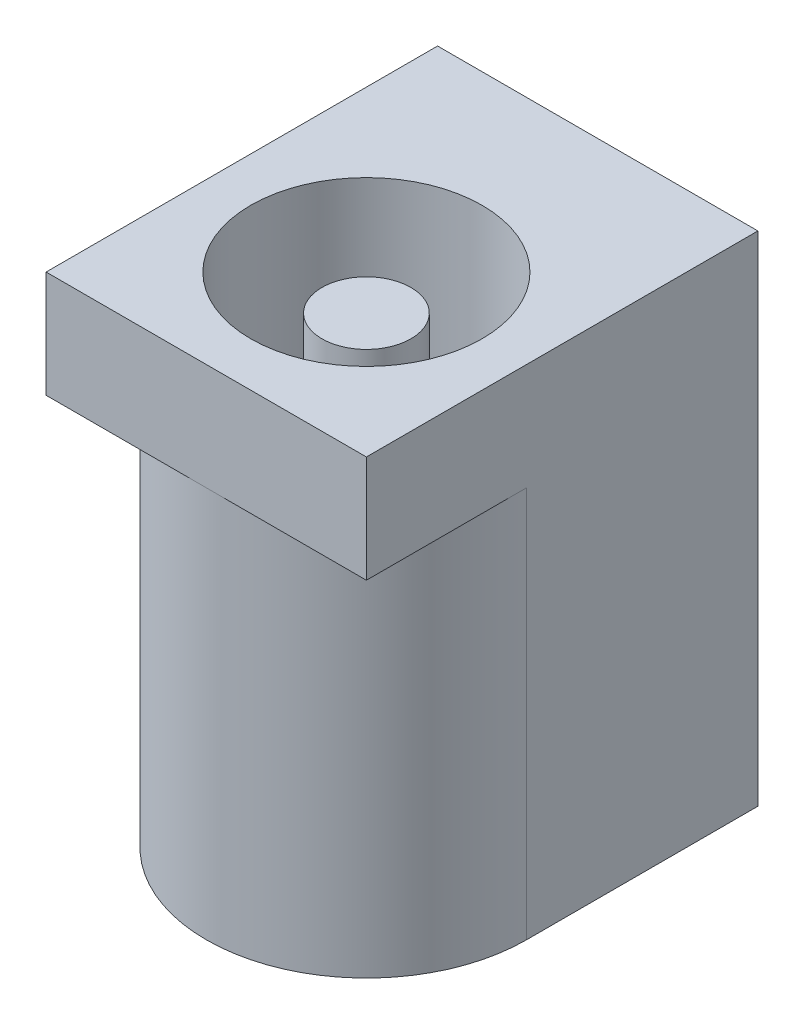
ISO-10303-21;
HEADER;
FILE_DESCRIPTION(('STEP AP214'),'2;1');
FILE_NAME('part.step','',(''),(''),'','','');
FILE_SCHEMA(('AUTOMOTIVE_DESIGN { 1 0 10303 214 1 1 1 1 }'));
ENDSEC;
DATA;
#1=APPLICATION_CONTEXT('core data for automotive mechanical design processes');
#2=APPLICATION_PROTOCOL_DEFINITION('international standard','automotive_design',2000,#1);
#3=PRODUCT_CONTEXT('',#1,'mechanical');
#4=PRODUCT('Part','Part','',(#3));
#5=PRODUCT_RELATED_PRODUCT_CATEGORY('part','',(#4));
#6=PRODUCT_DEFINITION_FORMATION('','',#4);
#7=PRODUCT_DEFINITION_CONTEXT('part definition',#1,'design');
#8=PRODUCT_DEFINITION('design','',#6,#7);
#9=PRODUCT_DEFINITION_SHAPE('','',#8);
#10=(LENGTH_UNIT() NAMED_UNIT(*) SI_UNIT(.MILLI.,.METRE.));
#11=(NAMED_UNIT(*) PLANE_ANGLE_UNIT() SI_UNIT($,.RADIAN.));
#12=(NAMED_UNIT(*) SI_UNIT($,.STERADIAN.) SOLID_ANGLE_UNIT());
#13=UNCERTAINTY_MEASURE_WITH_UNIT(LENGTH_MEASURE(1.E-05),#10,'distance_accuracy_value','');
#14=(GEOMETRIC_REPRESENTATION_CONTEXT(3) GLOBAL_UNCERTAINTY_ASSIGNED_CONTEXT((#13)) GLOBAL_UNIT_ASSIGNED_CONTEXT((#10,
#11,#12)) REPRESENTATION_CONTEXT('',''));
#15=CARTESIAN_POINT('',(0.,0.,0.));
#16=DIRECTION('',(0.,0.,1.));
#17=DIRECTION('',(1.,0.,0.));
#18=AXIS2_PLACEMENT_3D('',#15,#16,#17);
#19=CARTESIAN_POINT('',(-4.5,0.,11.));
#20=DIRECTION('',(0.,1.,0.));
#21=DIRECTION('',(0.,0.,1.));
#22=AXIS2_PLACEMENT_3D('',#19,#20,#21);
#23=PLANE('',#22);
#24=CARTESIAN_POINT('',(0.,0.,6.5));
#25=DIRECTION('',(0.,-1.,0.));
#26=DIRECTION('',(0.,0.,1.));
#27=AXIS2_PLACEMENT_3D('',#24,#25,#26);
#28=CIRCLE('',#27,4.5);
#29=CARTESIAN_POINT('',(4.5,0.,6.5));
#30=VERTEX_POINT('',#29);
#31=CARTESIAN_POINT('',(0.,0.,11.));
#32=VERTEX_POINT('',#31);
#33=EDGE_CURVE('E50',#30,#32,#28,.T.);
#34=ORIENTED_EDGE('',*,*,#33,.F.);
#35=DIRECTION('',(0.,0.,-1.));
#36=VECTOR('',#35,1.);
#37=CARTESIAN_POINT('',(4.5,0.,11.));
#38=LINE('',#37,#36);
#39=CARTESIAN_POINT('',(4.5,0.,11.));
#40=VERTEX_POINT('',#39);
#41=EDGE_CURVE('E167',#40,#30,#38,.T.);
#42=ORIENTED_EDGE('',*,*,#41,.F.);
#43=DIRECTION('',(1.,0.,0.));
#44=VECTOR('',#43,1.);
#45=CARTESIAN_POINT('',(-4.5,0.,11.));
#46=LINE('',#45,#44);
#47=EDGE_CURVE('E147',#32,#40,#46,.T.);
#48=ORIENTED_EDGE('',*,*,#47,.F.);
#49=EDGE_LOOP('',(#34,#42,#48));
#50=FACE_BOUND('',#49,.T.);
#51=ADVANCED_FACE('F39',(#50),#23,.F.);
#52=CARTESIAN_POINT('',(-4.5,3.,11.));
#53=DIRECTION('',(1.,0.,0.));
#54=DIRECTION('',(0.,0.,-1.));
#55=AXIS2_PLACEMENT_3D('',#52,#53,#54);
#56=PLANE('',#55);
#57=DIRECTION('',(0.,-1.,0.));
#58=VECTOR('',#57,1.);
#59=CARTESIAN_POINT('',(-4.5,3.,0.));
#60=LINE('',#59,#58);
#61=CARTESIAN_POINT('',(-4.5,3.,0.));
#62=VERTEX_POINT('',#61);
#63=CARTESIAN_POINT('',(-4.5,-11.,0.));
#64=VERTEX_POINT('',#63);
#65=EDGE_CURVE('E97',#62,#64,#60,.T.);
#66=ORIENTED_EDGE('',*,*,#65,.T.);
#67=DIRECTION('',(0.,0.,-1.));
#68=VECTOR('',#67,1.);
#69=CARTESIAN_POINT('',(-4.5,-11.,0.));
#70=LINE('',#69,#68);
#71=CARTESIAN_POINT('',(-4.5,-11.,6.5));
#72=VERTEX_POINT('',#71);
#73=EDGE_CURVE('E101',#72,#64,#70,.T.);
#74=ORIENTED_EDGE('',*,*,#73,.F.);
#75=DIRECTION('',(0.,1.,0.));
#76=VECTOR('',#75,1.);
#77=CARTESIAN_POINT('',(-4.5,-11.,6.5));
#78=LINE('',#77,#76);
#79=CARTESIAN_POINT('',(-4.5,0.,6.5));
#80=VERTEX_POINT('',#79);
#81=EDGE_CURVE('E136',#72,#80,#78,.T.);
#82=ORIENTED_EDGE('',*,*,#81,.T.);
#83=DIRECTION('',(0.,0.,-1.));
#84=VECTOR('',#83,1.);
#85=CARTESIAN_POINT('',(-4.5,0.,11.));
#86=LINE('',#85,#84);
#87=CARTESIAN_POINT('',(-4.5,0.,11.));
#88=VERTEX_POINT('',#87);
#89=EDGE_CURVE('E43',#88,#80,#86,.T.);
#90=ORIENTED_EDGE('',*,*,#89,.F.);
#91=DIRECTION('',(0.,-1.,0.));
#92=VECTOR('',#91,1.);
#93=CARTESIAN_POINT('',(-4.5,3.,11.));
#94=LINE('',#93,#92);
#95=CARTESIAN_POINT('',(-4.5,3.,11.));
#96=VERTEX_POINT('',#95);
#97=EDGE_CURVE('E143',#96,#88,#94,.T.);
#98=ORIENTED_EDGE('',*,*,#97,.F.);
#99=DIRECTION('',(0.,0.,-1.));
#100=VECTOR('',#99,1.);
#101=CARTESIAN_POINT('',(-4.5,3.,11.));
#102=LINE('',#101,#100);
#103=EDGE_CURVE('E104',#96,#62,#102,.T.);
#104=ORIENTED_EDGE('',*,*,#103,.T.);
#105=EDGE_LOOP('',(#66,#74,#82,#90,#98,#104));
#106=FACE_BOUND('',#105,.T.);
#107=ADVANCED_FACE('F41',(#106),#56,.F.);
#108=EDGE_CURVE('E12',#32,#80,#28,.T.);
#109=ORIENTED_EDGE('',*,*,#108,.F.);
#110=EDGE_CURVE('E149',#88,#32,#46,.T.);
#111=ORIENTED_EDGE('',*,*,#110,.F.);
#112=ORIENTED_EDGE('',*,*,#89,.T.);
#113=EDGE_LOOP('',(#109,#111,#112));
#114=FACE_BOUND('',#113,.T.);
#115=ADVANCED_FACE('F175',(#114),#23,.F.);
#116=CARTESIAN_POINT('',(4.5,3.,11.));
#117=DIRECTION('',(-1.,0.,0.));
#118=DIRECTION('',(0.,-1.,0.));
#119=AXIS2_PLACEMENT_3D('',#116,#117,#118);
#120=PLANE('',#119);
#121=DIRECTION('',(0.,1.,0.));
#122=VECTOR('',#121,1.);
#123=CARTESIAN_POINT('',(4.5,3.,0.));
#124=LINE('',#123,#122);
#125=CARTESIAN_POINT('',(4.5,-11.,0.));
#126=VERTEX_POINT('',#125);
#127=CARTESIAN_POINT('',(4.5,3.,0.));
#128=VERTEX_POINT('',#127);
#129=EDGE_CURVE('E108',#126,#128,#124,.T.);
#130=ORIENTED_EDGE('',*,*,#129,.T.);
#131=DIRECTION('',(0.,0.,-1.));
#132=VECTOR('',#131,1.);
#133=CARTESIAN_POINT('',(4.5,3.,11.));
#134=LINE('',#133,#132);
#135=CARTESIAN_POINT('',(4.5,3.,11.));
#136=VERTEX_POINT('',#135);
#137=EDGE_CURVE('E165',#136,#128,#134,.T.);
#138=ORIENTED_EDGE('',*,*,#137,.F.);
#139=DIRECTION('',(0.,1.,0.));
#140=VECTOR('',#139,1.);
#141=CARTESIAN_POINT('',(4.5,3.,11.));
#142=LINE('',#141,#140);
#143=EDGE_CURVE('E153',#40,#136,#142,.T.);
#144=ORIENTED_EDGE('',*,*,#143,.F.);
#145=ORIENTED_EDGE('',*,*,#41,.T.);
#146=DIRECTION('',(0.,1.,0.));
#147=VECTOR('',#146,1.);
#148=CARTESIAN_POINT('',(4.5,-11.,6.5));
#149=LINE('',#148,#147);
#150=CARTESIAN_POINT('',(4.5,-11.,6.5));
#151=VERTEX_POINT('',#150);
#152=EDGE_CURVE('E109',#151,#30,#149,.T.);
#153=ORIENTED_EDGE('',*,*,#152,.F.);
#154=DIRECTION('',(0.,0.,1.));
#155=VECTOR('',#154,1.);
#156=CARTESIAN_POINT('',(4.5,-11.,0.));
#157=LINE('',#156,#155);
#158=EDGE_CURVE('E117',#126,#151,#157,.T.);
#159=ORIENTED_EDGE('',*,*,#158,.F.);
#160=EDGE_LOOP('',(#130,#138,#144,#145,#153,#159));
#161=FACE_BOUND('',#160,.T.);
#162=ADVANCED_FACE('F178',(#161),#120,.F.);
#163=CARTESIAN_POINT('',(-4.5,3.,11.));
#164=DIRECTION('',(0.,-1.,0.));
#165=DIRECTION('',(1.,0.,0.));
#166=AXIS2_PLACEMENT_3D('',#163,#164,#165);
#167=PLANE('',#166);
#168=CARTESIAN_POINT('',(0.,3.,6.5));
#169=DIRECTION('',(0.,1.,0.));
#170=DIRECTION('',(-1.,0.,0.));
#171=AXIS2_PLACEMENT_3D('',#168,#169,#170);
#172=CIRCLE('',#171,3.25);
#173=CARTESIAN_POINT('',(-3.25,3.,6.5));
#174=VERTEX_POINT('',#173);
#175=EDGE_CURVE('E130',#174,#174,#172,.T.);
#176=ORIENTED_EDGE('',*,*,#175,.F.);
#177=EDGE_LOOP('',(#176));
#178=FACE_BOUND('',#177,.T.);
#179=DIRECTION('',(-1.,0.,0.));
#180=VECTOR('',#179,1.);
#181=CARTESIAN_POINT('',(-4.5,3.,0.));
#182=LINE('',#181,#180);
#183=EDGE_CURVE('E148',#128,#62,#182,.T.);
#184=ORIENTED_EDGE('',*,*,#183,.T.);
#185=ORIENTED_EDGE('',*,*,#103,.F.);
#186=DIRECTION('',(-1.,0.,0.));
#187=VECTOR('',#186,1.);
#188=CARTESIAN_POINT('',(-4.5,3.,11.));
#189=LINE('',#188,#187);
#190=EDGE_CURVE('E156',#136,#96,#189,.T.);
#191=ORIENTED_EDGE('',*,*,#190,.F.);
#192=ORIENTED_EDGE('',*,*,#137,.T.);
#193=EDGE_LOOP('',(#184,#185,#191,#192));
#194=FACE_BOUND('',#193,.T.);
#195=ADVANCED_FACE('F182',(#178,#194),#167,.F.);
#196=CARTESIAN_POINT('',(0.,0.,11.));
#197=DIRECTION('',(0.,0.,1.));
#198=DIRECTION('',(1.,0.,0.));
#199=AXIS2_PLACEMENT_3D('',#196,#197,#198);
#200=PLANE('',#199);
#201=ORIENTED_EDGE('',*,*,#97,.T.);
#202=ORIENTED_EDGE('',*,*,#110,.T.);
#203=ORIENTED_EDGE('',*,*,#47,.T.);
#204=ORIENTED_EDGE('',*,*,#143,.T.);
#205=ORIENTED_EDGE('',*,*,#190,.T.);
#206=EDGE_LOOP('',(#201,#202,#203,#204,#205));
#207=FACE_BOUND('',#206,.T.);
#208=ADVANCED_FACE('F184',(#207),#200,.T.);
#209=CARTESIAN_POINT('',(0.,0.,0.));
#210=DIRECTION('',(0.,0.,1.));
#211=DIRECTION('',(1.,0.,0.));
#212=AXIS2_PLACEMENT_3D('',#209,#210,#211);
#213=PLANE('',#212);
#214=ORIENTED_EDGE('',*,*,#65,.F.);
#215=ORIENTED_EDGE('',*,*,#183,.F.);
#216=ORIENTED_EDGE('',*,*,#129,.F.);
#217=DIRECTION('',(1.,0.,0.));
#218=VECTOR('',#217,1.);
#219=CARTESIAN_POINT('',(-4.5,-11.,0.));
#220=LINE('',#219,#218);
#221=EDGE_CURVE('E112',#64,#126,#220,.T.);
#222=ORIENTED_EDGE('',*,*,#221,.F.);
#223=EDGE_LOOP('',(#214,#215,#216,#222));
#224=FACE_BOUND('',#223,.T.);
#225=ADVANCED_FACE('F113',(#224),#213,.F.);
#226=CARTESIAN_POINT('',(0.,-11.,6.5));
#227=DIRECTION('',(0.,1.,0.));
#228=DIRECTION('',(0.,0.,1.));
#229=AXIS2_PLACEMENT_3D('',#226,#227,#228);
#230=CYLINDRICAL_SURFACE('',#229,4.5);
#231=ORIENTED_EDGE('',*,*,#33,.T.);
#232=ORIENTED_EDGE('',*,*,#108,.T.);
#233=ORIENTED_EDGE('',*,*,#81,.F.);
#234=CARTESIAN_POINT('',(0.,-11.,6.5));
#235=DIRECTION('',(0.,-1.,0.));
#236=DIRECTION('',(0.,0.,1.));
#237=AXIS2_PLACEMENT_3D('',#234,#235,#236);
#238=CIRCLE('',#237,4.5);
#239=EDGE_CURVE('E121',#151,#72,#238,.T.);
#240=ORIENTED_EDGE('',*,*,#239,.F.);
#241=ORIENTED_EDGE('',*,*,#152,.T.);
#242=EDGE_LOOP('',(#231,#232,#233,#240,#241));
#243=FACE_BOUND('',#242,.T.);
#244=ADVANCED_FACE('F177',(#243),#230,.T.);
#245=CARTESIAN_POINT('',(0.,-11.,6.5));
#246=DIRECTION('',(0.,1.,0.));
#247=DIRECTION('',(0.,0.,1.));
#248=AXIS2_PLACEMENT_3D('',#245,#246,#247);
#249=PLANE('',#248);
#250=ORIENTED_EDGE('',*,*,#73,.T.);
#251=ORIENTED_EDGE('',*,*,#221,.T.);
#252=ORIENTED_EDGE('',*,*,#158,.T.);
#253=ORIENTED_EDGE('',*,*,#239,.T.);
#254=EDGE_LOOP('',(#250,#251,#252,#253));
#255=FACE_BOUND('',#254,.T.);
#256=ADVANCED_FACE('F119',(#255),#249,.F.);
#257=CARTESIAN_POINT('',(0.,-10.,6.5));
#258=DIRECTION('',(0.,1.,0.));
#259=DIRECTION('',(-1.,0.,0.));
#260=AXIS2_PLACEMENT_3D('',#257,#258,#259);
#261=CYLINDRICAL_SURFACE('',#260,3.25);
#262=CARTESIAN_POINT('',(0.,-10.,6.5));
#263=DIRECTION('',(0.,1.,0.));
#264=DIRECTION('',(-1.,0.,0.));
#265=AXIS2_PLACEMENT_3D('',#262,#263,#264);
#266=CIRCLE('',#265,3.25);
#267=CARTESIAN_POINT('',(-3.25,-10.,6.5));
#268=VERTEX_POINT('',#267);
#269=EDGE_CURVE('E128',#268,#268,#266,.T.);
#270=CARTESIAN_POINT('',(-3.25,-10.,6.5));
#271=CARTESIAN_POINT('',(-3.25,-9.86458333333333,6.5));
#272=CARTESIAN_POINT('',(-3.25,-9.72916666666667,6.5));
#273=CARTESIAN_POINT('',(-3.25,-9.45833333333333,6.5));
#274=CARTESIAN_POINT('',(-3.25,-9.32291666666667,6.5));
#275=CARTESIAN_POINT('',(-3.25,-9.05208333333333,6.5));
#276=CARTESIAN_POINT('',(-3.25,-8.91666666666667,6.5));
#277=CARTESIAN_POINT('',(-3.25,-8.64583333333333,6.5));
#278=CARTESIAN_POINT('',(-3.25,-8.51041666666667,6.5));
#279=CARTESIAN_POINT('',(-3.25,-8.23958333333334,6.5));
#280=CARTESIAN_POINT('',(-3.25,-8.10416666666667,6.5));
#281=CARTESIAN_POINT('',(-3.25,-7.83333333333333,6.5));
#282=CARTESIAN_POINT('',(-3.25,-7.69791666666667,6.5));
#283=CARTESIAN_POINT('',(-3.25,-7.42708333333333,6.5));
#284=CARTESIAN_POINT('',(-3.25,-7.29166666666667,6.5));
#285=CARTESIAN_POINT('',(-3.25,-7.02083333333333,6.5));
#286=CARTESIAN_POINT('',(-3.25,-6.88541666666667,6.5));
#287=CARTESIAN_POINT('',(-3.25,-6.61458333333333,6.5));
#288=CARTESIAN_POINT('',(-3.25,-6.47916666666667,6.5));
#289=CARTESIAN_POINT('',(-3.25,-6.20833333333333,6.5));
#290=CARTESIAN_POINT('',(-3.25,-6.07291666666667,6.5));
#291=CARTESIAN_POINT('',(-3.25,-5.80208333333334,6.5));
#292=CARTESIAN_POINT('',(-3.25,-5.66666666666667,6.5));
#293=CARTESIAN_POINT('',(-3.25,-5.39583333333333,6.5));
#294=CARTESIAN_POINT('',(-3.25,-5.26041666666667,6.5));
#295=CARTESIAN_POINT('',(-3.25,-4.98958333333333,6.5));
#296=CARTESIAN_POINT('',(-3.25,-4.85416666666667,6.5));
#297=CARTESIAN_POINT('',(-3.25,-4.58333333333333,6.5));
#298=CARTESIAN_POINT('',(-3.25,-4.44791666666667,6.5));
#299=CARTESIAN_POINT('',(-3.25,-4.17708333333333,6.5));
#300=CARTESIAN_POINT('',(-3.25,-4.04166666666667,6.5));
#301=CARTESIAN_POINT('',(-3.25,-3.77083333333333,6.5));
#302=CARTESIAN_POINT('',(-3.25,-3.63541666666667,6.5));
#303=CARTESIAN_POINT('',(-3.25,-3.36458333333333,6.5));
#304=CARTESIAN_POINT('',(-3.25,-3.22916666666667,6.5));
#305=CARTESIAN_POINT('',(-3.25,-2.95833333333333,6.5));
#306=CARTESIAN_POINT('',(-3.25,-2.82291666666667,6.5));
#307=CARTESIAN_POINT('',(-3.25,-2.55208333333333,6.5));
#308=CARTESIAN_POINT('',(-3.25,-2.41666666666667,6.5));
#309=CARTESIAN_POINT('',(-3.25,-2.14583333333333,6.5));
#310=CARTESIAN_POINT('',(-3.25,-2.01041666666667,6.5));
#311=CARTESIAN_POINT('',(-3.25,-1.73958333333333,6.5));
#312=CARTESIAN_POINT('',(-3.25,-1.60416666666667,6.5));
#313=CARTESIAN_POINT('',(-3.25,-1.33333333333333,6.5));
#314=CARTESIAN_POINT('',(-3.25,-1.19791666666667,6.5));
#315=CARTESIAN_POINT('',(-3.25,-0.927083333333334,6.5));
#316=CARTESIAN_POINT('',(-3.25,-0.791666666666667,6.5));
#317=CARTESIAN_POINT('',(-3.25,-0.520833333333334,6.5));
#318=CARTESIAN_POINT('',(-3.25,-0.385416666666667,6.5));
#319=CARTESIAN_POINT('',(-3.25,-0.114583333333334,6.5));
#320=CARTESIAN_POINT('',(-3.25,0.0208333333333322,6.5));
#321=CARTESIAN_POINT('',(-3.25,0.291666666666665,6.5));
#322=CARTESIAN_POINT('',(-3.25,0.427083333333332,6.5));
#323=CARTESIAN_POINT('',(-3.25,0.697916666666666,6.5));
#324=CARTESIAN_POINT('',(-3.25,0.833333333333332,6.5));
#325=CARTESIAN_POINT('',(-3.25,1.10416666666667,6.5));
#326=CARTESIAN_POINT('',(-3.25,1.23958333333333,6.5));
#327=CARTESIAN_POINT('',(-3.25,1.51041666666667,6.5));
#328=CARTESIAN_POINT('',(-3.25,1.64583333333333,6.5));
#329=CARTESIAN_POINT('',(-3.25,1.91666666666667,6.5));
#330=CARTESIAN_POINT('',(-3.25,2.05208333333333,6.5));
#331=CARTESIAN_POINT('',(-3.25,2.32291666666667,6.5));
#332=CARTESIAN_POINT('',(-3.25,2.45833333333333,6.5));
#333=CARTESIAN_POINT('',(-3.25,2.72916666666667,6.5));
#334=CARTESIAN_POINT('',(-3.25,2.86458333333333,6.5));
#335=CARTESIAN_POINT('',(-3.25,3.,6.5));
#336=B_SPLINE_CURVE_WITH_KNOTS('',3,(#270,#271,#272,#273,#274,#275,#276,#277,#278,#279,#280,
#281,#282,#283,#284,#285,#286,#287,#288,#289,#290,#291,#292,#293,#294,#295,#296,#297,#298,#299,
#300,#301,#302,#303,#304,#305,#306,#307,#308,#309,#310,#311,#312,#313,#314,#315,#316,#317,#318,
#319,#320,#321,#322,#323,#324,#325,#326,#327,#328,#329,#330,#331,#332,#333,#334,#335),
.UNSPECIFIED.,.F.,.F.,(4,2,2,2,2,2,2,2,2,2,2,2,2,2,2,2,2,2,2,2,2,2,2,2,2,2,2,2,2,2,2,2,4),(0.,
0.406249999999999,0.812499999999999,1.21875,1.625,2.03125,2.4375,2.84375,3.25,3.65625,4.0625,
4.46875,4.875,5.28125,5.6875,6.09375,6.5,6.90625,7.3125,7.71875,8.125,8.53125,8.9375,9.34375,
9.75,10.15625,10.5625,10.96875,11.375,11.78125,12.1875,12.59375,13.),.UNSPECIFIED.);
#337=EDGE_CURVE('BSEAM209',#268,#174,#336,.T.);
#338=ORIENTED_EDGE('',*,*,#269,.F.);
#339=ORIENTED_EDGE('',*,*,#175,.T.);
#340=ORIENTED_EDGE('',*,*,#337,.T.);
#341=ORIENTED_EDGE('',*,*,#337,.F.);
#342=EDGE_LOOP('',(#338,#340,#339,#341));
#343=FACE_BOUND('',#342,.T.);
#344=ADVANCED_FACE('F209',(#343),#261,.F.);
#345=CARTESIAN_POINT('',(0.,-10.,6.5));
#346=DIRECTION('',(0.,1.,0.));
#347=DIRECTION('',(-1.,0.,0.));
#348=AXIS2_PLACEMENT_3D('',#345,#346,#347);
#349=PLANE('',#348);
#350=CARTESIAN_POINT('',(0.,-10.,6.5));
#351=DIRECTION('',(0.,1.,0.));
#352=DIRECTION('',(-1.,0.,0.));
#353=AXIS2_PLACEMENT_3D('',#350,#351,#352);
#354=CIRCLE('',#353,1.25);
#355=CARTESIAN_POINT('',(-1.25,-10.,6.5));
#356=VERTEX_POINT('',#355);
#357=EDGE_CURVE('E229',#356,#356,#354,.T.);
#358=ORIENTED_EDGE('',*,*,#357,.F.);
#359=EDGE_LOOP('',(#358));
#360=FACE_BOUND('',#359,.T.);
#361=ORIENTED_EDGE('',*,*,#269,.T.);
#362=EDGE_LOOP('',(#361));
#363=FACE_BOUND('',#362,.T.);
#364=ADVANCED_FACE('F212',(#360,#363),#349,.T.);
#365=CARTESIAN_POINT('',(0.,6.53553390593274,6.5));
#366=DIRECTION('',(0.,-1.,0.));
#367=DIRECTION('',(1.,0.,0.));
#368=AXIS2_PLACEMENT_3D('',#365,#366,#367);
#369=CYLINDRICAL_SURFACE('',#368,1.25);
#370=CARTESIAN_POINT('',(0.,2.,6.5));
#371=DIRECTION('',(0.,-1.,0.));
#372=DIRECTION('',(1.,0.,0.));
#373=AXIS2_PLACEMENT_3D('',#370,#371,#372);
#374=CIRCLE('',#373,1.25);
#375=CARTESIAN_POINT('',(1.25,2.,6.5));
#376=VERTEX_POINT('',#375);
#377=EDGE_CURVE('E228',#376,#376,#374,.T.);
#378=ORIENTED_EDGE('',*,*,#377,.T.);
#379=EDGE_LOOP('',(#378));
#380=FACE_BOUND('',#379,.T.);
#381=ORIENTED_EDGE('',*,*,#357,.T.);
#382=EDGE_LOOP('',(#381));
#383=FACE_BOUND('',#382,.T.);
#384=ADVANCED_FACE('F216',(#380,#383),#369,.T.);
#385=CARTESIAN_POINT('',(-4.5,2.,11.));
#386=DIRECTION('',(0.,-1.,0.));
#387=DIRECTION('',(1.,0.,0.));
#388=AXIS2_PLACEMENT_3D('',#385,#386,#387);
#389=PLANE('',#388);
#390=ORIENTED_EDGE('',*,*,#377,.F.);
#391=EDGE_LOOP('',(#390));
#392=FACE_BOUND('',#391,.T.);
#393=ADVANCED_FACE('F220',(#392),#389,.F.);
#394=CLOSED_SHELL('',(#51,#107,#115,#162,#195,#208,#225,#244,#256,#344,#364,#384,#393));
#395=MANIFOLD_SOLID_BREP('B2',#394);
#396=ADVANCED_BREP_SHAPE_REPRESENTATION('',(#18,#395),#14);
#397=SHAPE_DEFINITION_REPRESENTATION(#9,#396);
ENDSEC;
END-ISO-10303-21;
